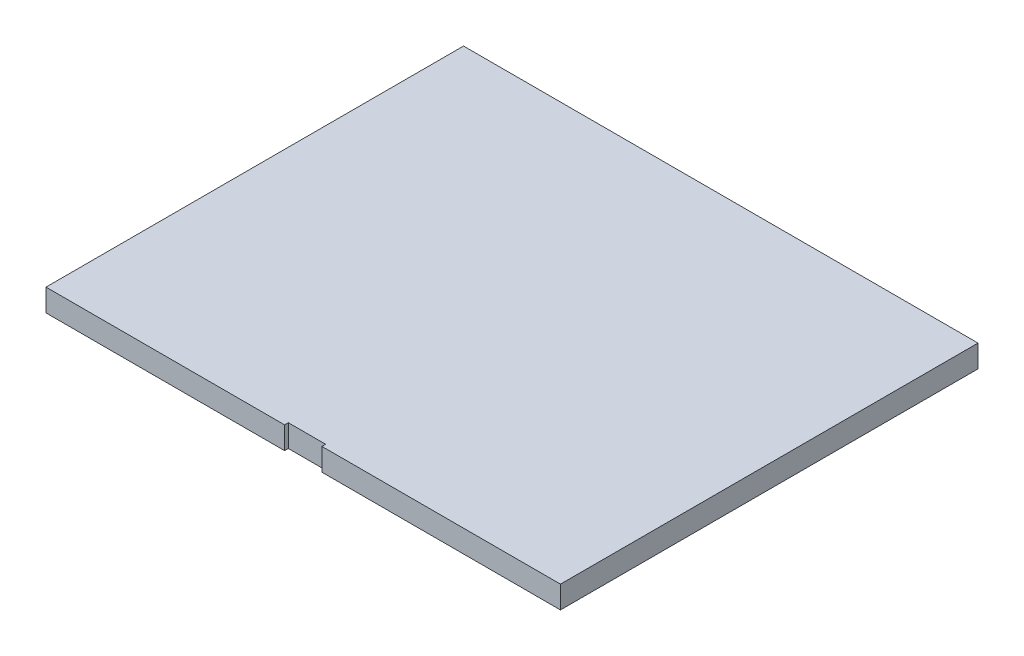
ISO-10303-21;
HEADER;
FILE_DESCRIPTION(('STEP AP214'),'2;1');
FILE_NAME('part.step','',(''),(''),'','','');
FILE_SCHEMA(('AUTOMOTIVE_DESIGN { 1 0 10303 214 1 1 1 1 }'));
ENDSEC;
DATA;
#1=APPLICATION_CONTEXT('core data for automotive mechanical design processes');
#2=APPLICATION_PROTOCOL_DEFINITION('international standard','automotive_design',2000,#1);
#3=PRODUCT_CONTEXT('',#1,'mechanical');
#4=PRODUCT('Part','Part','',(#3));
#5=PRODUCT_RELATED_PRODUCT_CATEGORY('part','',(#4));
#6=PRODUCT_DEFINITION_FORMATION('','',#4);
#7=PRODUCT_DEFINITION_CONTEXT('part definition',#1,'design');
#8=PRODUCT_DEFINITION('design','',#6,#7);
#9=PRODUCT_DEFINITION_SHAPE('','',#8);
#10=(LENGTH_UNIT() NAMED_UNIT(*) SI_UNIT(.MILLI.,.METRE.));
#11=(NAMED_UNIT(*) PLANE_ANGLE_UNIT() SI_UNIT($,.RADIAN.));
#12=(NAMED_UNIT(*) SI_UNIT($,.STERADIAN.) SOLID_ANGLE_UNIT());
#13=UNCERTAINTY_MEASURE_WITH_UNIT(LENGTH_MEASURE(1.E-05),#10,'distance_accuracy_value','');
#14=(GEOMETRIC_REPRESENTATION_CONTEXT(3) GLOBAL_UNCERTAINTY_ASSIGNED_CONTEXT((#13)) GLOBAL_UNIT_ASSIGNED_CONTEXT((#10,
#11,#12)) REPRESENTATION_CONTEXT('',''));
#15=CARTESIAN_POINT('',(0.,0.,0.));
#16=DIRECTION('',(0.,0.,1.));
#17=DIRECTION('',(1.,0.,0.));
#18=AXIS2_PLACEMENT_3D('',#15,#16,#17);
#19=CARTESIAN_POINT('',(0.,19.05,0.));
#20=DIRECTION('',(0.,0.,-1.));
#21=DIRECTION('',(-1.,0.,0.));
#22=AXIS2_PLACEMENT_3D('',#19,#20,#21);
#23=PLANE('',#22);
#24=DIRECTION('',(1.,0.,0.));
#25=VECTOR('',#24,1.);
#26=CARTESIAN_POINT('',(0.,0.,0.));
#27=LINE('',#26,#25);
#28=CARTESIAN_POINT('',(0.,0.,0.));
#29=VERTEX_POINT('',#28);
#30=CARTESIAN_POINT('',(203.2,0.,0.));
#31=VERTEX_POINT('',#30);
#32=EDGE_CURVE('E156',#29,#31,#27,.T.);
#33=ORIENTED_EDGE('',*,*,#32,.T.);
#34=DIRECTION('',(0.,1.,0.));
#35=VECTOR('',#34,1.);
#36=CARTESIAN_POINT('',(203.2,0.,0.));
#37=LINE('',#36,#35);
#38=CARTESIAN_POINT('',(203.2,19.05,0.));
#39=VERTEX_POINT('',#38);
#40=EDGE_CURVE('E165',#31,#39,#37,.T.);
#41=ORIENTED_EDGE('',*,*,#40,.T.);
#42=DIRECTION('',(1.,0.,0.));
#43=VECTOR('',#42,1.);
#44=CARTESIAN_POINT('',(0.,19.05,0.));
#45=LINE('',#44,#43);
#46=CARTESIAN_POINT('',(0.,19.05,0.));
#47=VERTEX_POINT('',#46);
#48=EDGE_CURVE('E102',#47,#39,#45,.T.);
#49=ORIENTED_EDGE('',*,*,#48,.F.);
#50=DIRECTION('',(0.,-1.,0.));
#51=VECTOR('',#50,1.);
#52=CARTESIAN_POINT('',(0.,19.05,0.));
#53=LINE('',#52,#51);
#54=EDGE_CURVE('E11',#47,#29,#53,.T.);
#55=ORIENTED_EDGE('',*,*,#54,.T.);
#56=EDGE_LOOP('',(#33,#41,#49,#55));
#57=FACE_BOUND('',#56,.T.);
#58=ADVANCED_FACE('F38',(#57),#23,.F.);
#59=CARTESIAN_POINT('',(0.,19.05,0.));
#60=DIRECTION('',(1.,0.,0.));
#61=DIRECTION('',(0.,0.,-1.));
#62=AXIS2_PLACEMENT_3D('',#59,#60,#61);
#63=PLANE('',#62);
#64=DIRECTION('',(0.,0.,1.));
#65=VECTOR('',#64,1.);
#66=CARTESIAN_POINT('',(0.,0.,0.));
#67=LINE('',#66,#65);
#68=CARTESIAN_POINT('',(0.,0.,-355.6));
#69=VERTEX_POINT('',#68);
#70=EDGE_CURVE('E157',#69,#29,#67,.T.);
#71=ORIENTED_EDGE('',*,*,#70,.T.);
#72=ORIENTED_EDGE('',*,*,#54,.F.);
#73=DIRECTION('',(0.,0.,1.));
#74=VECTOR('',#73,1.);
#75=CARTESIAN_POINT('',(0.,19.05,0.));
#76=LINE('',#75,#74);
#77=CARTESIAN_POINT('',(0.,19.05,-355.6));
#78=VERTEX_POINT('',#77);
#79=EDGE_CURVE('E173',#78,#47,#76,.T.);
#80=ORIENTED_EDGE('',*,*,#79,.F.);
#81=DIRECTION('',(0.,-1.,0.));
#82=VECTOR('',#81,1.);
#83=CARTESIAN_POINT('',(0.,19.05,-355.6));
#84=LINE('',#83,#82);
#85=EDGE_CURVE('E174',#78,#69,#84,.T.);
#86=ORIENTED_EDGE('',*,*,#85,.T.);
#87=EDGE_LOOP('',(#71,#72,#80,#86));
#88=FACE_BOUND('',#87,.T.);
#89=ADVANCED_FACE('F40',(#88),#63,.F.);
#90=CARTESIAN_POINT('',(234.95,19.05,0.));
#91=VERTEX_POINT('',#90);
#92=CARTESIAN_POINT('',(438.15,19.05,0.));
#93=VERTEX_POINT('',#92);
#94=EDGE_CURVE('E147',#91,#93,#45,.T.);
#95=ORIENTED_EDGE('',*,*,#94,.F.);
#96=DIRECTION('',(0.,1.,0.));
#97=VECTOR('',#96,1.);
#98=CARTESIAN_POINT('',(234.95,0.,0.));
#99=LINE('',#98,#97);
#100=CARTESIAN_POINT('',(234.95,0.,0.));
#101=VERTEX_POINT('',#100);
#102=EDGE_CURVE('E133',#101,#91,#99,.T.);
#103=ORIENTED_EDGE('',*,*,#102,.F.);
#104=CARTESIAN_POINT('',(438.15,0.,0.));
#105=VERTEX_POINT('',#104);
#106=EDGE_CURVE('E145',#101,#105,#27,.T.);
#107=ORIENTED_EDGE('',*,*,#106,.T.);
#108=DIRECTION('',(0.,-1.,0.));
#109=VECTOR('',#108,1.);
#110=CARTESIAN_POINT('',(438.15,19.05,0.));
#111=LINE('',#110,#109);
#112=EDGE_CURVE('E47',#93,#105,#111,.T.);
#113=ORIENTED_EDGE('',*,*,#112,.F.);
#114=EDGE_LOOP('',(#95,#103,#107,#113));
#115=FACE_BOUND('',#114,.T.);
#116=ADVANCED_FACE('F143',(#115),#23,.F.);
#117=CARTESIAN_POINT('',(438.15,19.05,0.));
#118=DIRECTION('',(-1.,0.,0.));
#119=DIRECTION('',(0.,0.,1.));
#120=AXIS2_PLACEMENT_3D('',#117,#118,#119);
#121=PLANE('',#120);
#122=DIRECTION('',(0.,0.,-1.));
#123=VECTOR('',#122,1.);
#124=CARTESIAN_POINT('',(438.15,0.,0.));
#125=LINE('',#124,#123);
#126=CARTESIAN_POINT('',(438.15,0.,-355.6));
#127=VERTEX_POINT('',#126);
#128=EDGE_CURVE('E154',#105,#127,#125,.T.);
#129=ORIENTED_EDGE('',*,*,#128,.T.);
#130=DIRECTION('',(0.,-1.,0.));
#131=VECTOR('',#130,1.);
#132=CARTESIAN_POINT('',(438.15,19.05,-355.6));
#133=LINE('',#132,#131);
#134=CARTESIAN_POINT('',(438.15,19.05,-355.6));
#135=VERTEX_POINT('',#134);
#136=EDGE_CURVE('E177',#135,#127,#133,.T.);
#137=ORIENTED_EDGE('',*,*,#136,.F.);
#138=DIRECTION('',(0.,0.,-1.));
#139=VECTOR('',#138,1.);
#140=CARTESIAN_POINT('',(438.15,19.05,0.));
#141=LINE('',#140,#139);
#142=EDGE_CURVE('E184',#93,#135,#141,.T.);
#143=ORIENTED_EDGE('',*,*,#142,.F.);
#144=ORIENTED_EDGE('',*,*,#112,.T.);
#145=EDGE_LOOP('',(#129,#137,#143,#144));
#146=FACE_BOUND('',#145,.T.);
#147=ADVANCED_FACE('F182',(#146),#121,.F.);
#148=CARTESIAN_POINT('',(0.,19.05,-355.6));
#149=DIRECTION('',(0.,0.,1.));
#150=DIRECTION('',(1.,0.,0.));
#151=AXIS2_PLACEMENT_3D('',#148,#149,#150);
#152=PLANE('',#151);
#153=DIRECTION('',(-1.,0.,0.));
#154=VECTOR('',#153,1.);
#155=CARTESIAN_POINT('',(0.,0.,-355.6));
#156=LINE('',#155,#154);
#157=EDGE_CURVE('E95',#127,#69,#156,.T.);
#158=ORIENTED_EDGE('',*,*,#157,.T.);
#159=ORIENTED_EDGE('',*,*,#85,.F.);
#160=DIRECTION('',(-1.,0.,0.));
#161=VECTOR('',#160,1.);
#162=CARTESIAN_POINT('',(0.,19.05,-355.6));
#163=LINE('',#162,#161);
#164=EDGE_CURVE('E69',#135,#78,#163,.T.);
#165=ORIENTED_EDGE('',*,*,#164,.F.);
#166=ORIENTED_EDGE('',*,*,#136,.T.);
#167=EDGE_LOOP('',(#158,#159,#165,#166));
#168=FACE_BOUND('',#167,.T.);
#169=ADVANCED_FACE('F217',(#168),#152,.F.);
#170=CARTESIAN_POINT('',(0.,19.05,0.));
#171=DIRECTION('',(0.,-1.,0.));
#172=DIRECTION('',(0.,0.,-1.));
#173=AXIS2_PLACEMENT_3D('',#170,#171,#172);
#174=PLANE('',#173);
#175=ORIENTED_EDGE('',*,*,#48,.T.);
#176=DIRECTION('',(0.,0.,1.));
#177=VECTOR('',#176,1.);
#178=CARTESIAN_POINT('',(203.2,19.05,0.));
#179=LINE('',#178,#177);
#180=CARTESIAN_POINT('',(203.2,19.05,-3.17500000000004));
#181=VERTEX_POINT('',#180);
#182=EDGE_CURVE('E139',#181,#39,#179,.T.);
#183=ORIENTED_EDGE('',*,*,#182,.F.);
#184=DIRECTION('',(-1.,0.,0.));
#185=VECTOR('',#184,1.);
#186=CARTESIAN_POINT('',(203.2,19.05,-3.17500000000004));
#187=LINE('',#186,#185);
#188=CARTESIAN_POINT('',(234.95,19.05,-3.17500000000003));
#189=VERTEX_POINT('',#188);
#190=EDGE_CURVE('E201',#189,#181,#187,.T.);
#191=ORIENTED_EDGE('',*,*,#190,.F.);
#192=DIRECTION('',(0.,0.,-1.));
#193=VECTOR('',#192,1.);
#194=CARTESIAN_POINT('',(234.95,19.05,-3.17500000000003));
#195=LINE('',#194,#193);
#196=EDGE_CURVE('E205',#91,#189,#195,.T.);
#197=ORIENTED_EDGE('',*,*,#196,.F.);
#198=ORIENTED_EDGE('',*,*,#94,.T.);
#199=ORIENTED_EDGE('',*,*,#142,.T.);
#200=ORIENTED_EDGE('',*,*,#164,.T.);
#201=ORIENTED_EDGE('',*,*,#79,.T.);
#202=EDGE_LOOP('',(#175,#183,#191,#197,#198,#199,#200,#201));
#203=FACE_BOUND('',#202,.T.);
#204=ADVANCED_FACE('F219',(#203),#174,.F.);
#205=CARTESIAN_POINT('',(0.,0.,0.));
#206=DIRECTION('',(0.,-1.,0.));
#207=DIRECTION('',(0.,0.,-1.));
#208=AXIS2_PLACEMENT_3D('',#205,#206,#207);
#209=PLANE('',#208);
#210=DIRECTION('',(0.,0.,1.));
#211=VECTOR('',#210,1.);
#212=CARTESIAN_POINT('',(203.2,0.,0.));
#213=LINE('',#212,#211);
#214=CARTESIAN_POINT('',(203.2,0.,-3.17500000000004));
#215=VERTEX_POINT('',#214);
#216=EDGE_CURVE('E149',#215,#31,#213,.T.);
#217=ORIENTED_EDGE('',*,*,#216,.T.);
#218=ORIENTED_EDGE('',*,*,#32,.F.);
#219=ORIENTED_EDGE('',*,*,#70,.F.);
#220=ORIENTED_EDGE('',*,*,#157,.F.);
#221=ORIENTED_EDGE('',*,*,#128,.F.);
#222=ORIENTED_EDGE('',*,*,#106,.F.);
#223=DIRECTION('',(0.,0.,-1.));
#224=VECTOR('',#223,1.);
#225=CARTESIAN_POINT('',(234.95,0.,-3.17500000000003));
#226=LINE('',#225,#224);
#227=CARTESIAN_POINT('',(234.95,0.,-3.17500000000003));
#228=VERTEX_POINT('',#227);
#229=EDGE_CURVE('E129',#101,#228,#226,.T.);
#230=ORIENTED_EDGE('',*,*,#229,.T.);
#231=DIRECTION('',(-1.,0.,0.));
#232=VECTOR('',#231,1.);
#233=CARTESIAN_POINT('',(203.2,0.,-3.17500000000004));
#234=LINE('',#233,#232);
#235=EDGE_CURVE('E57',#228,#215,#234,.T.);
#236=ORIENTED_EDGE('',*,*,#235,.T.);
#237=EDGE_LOOP('',(#217,#218,#219,#220,#221,#222,#230,#236));
#238=FACE_BOUND('',#237,.T.);
#239=ADVANCED_FACE('F153',(#238),#209,.T.);
#240=CARTESIAN_POINT('',(203.2,0.,0.));
#241=DIRECTION('',(-1.,0.,0.));
#242=DIRECTION('',(0.,0.,1.));
#243=AXIS2_PLACEMENT_3D('',#240,#241,#242);
#244=PLANE('',#243);
#245=ORIENTED_EDGE('',*,*,#182,.T.);
#246=ORIENTED_EDGE('',*,*,#40,.F.);
#247=ORIENTED_EDGE('',*,*,#216,.F.);
#248=DIRECTION('',(0.,1.,0.));
#249=VECTOR('',#248,1.);
#250=CARTESIAN_POINT('',(203.2,0.,-3.17500000000004));
#251=LINE('',#250,#249);
#252=EDGE_CURVE('E194',#215,#181,#251,.T.);
#253=ORIENTED_EDGE('',*,*,#252,.T.);
#254=EDGE_LOOP('',(#245,#246,#247,#253));
#255=FACE_BOUND('',#254,.T.);
#256=ADVANCED_FACE('F251',(#255),#244,.F.);
#257=CARTESIAN_POINT('',(203.2,0.,-3.17500000000004));
#258=DIRECTION('',(0.,0.,-1.));
#259=DIRECTION('',(-1.,0.,0.));
#260=AXIS2_PLACEMENT_3D('',#257,#258,#259);
#261=PLANE('',#260);
#262=ORIENTED_EDGE('',*,*,#190,.T.);
#263=ORIENTED_EDGE('',*,*,#252,.F.);
#264=ORIENTED_EDGE('',*,*,#235,.F.);
#265=DIRECTION('',(0.,1.,0.));
#266=VECTOR('',#265,1.);
#267=CARTESIAN_POINT('',(234.95,0.,-3.17500000000003));
#268=LINE('',#267,#266);
#269=EDGE_CURVE('E135',#228,#189,#268,.T.);
#270=ORIENTED_EDGE('',*,*,#269,.T.);
#271=EDGE_LOOP('',(#262,#263,#264,#270));
#272=FACE_BOUND('',#271,.T.);
#273=ADVANCED_FACE('F280',(#272),#261,.F.);
#274=CARTESIAN_POINT('',(234.95,0.,-3.17500000000003));
#275=DIRECTION('',(1.,0.,0.));
#276=DIRECTION('',(0.,0.,-1.));
#277=AXIS2_PLACEMENT_3D('',#274,#275,#276);
#278=PLANE('',#277);
#279=ORIENTED_EDGE('',*,*,#196,.T.);
#280=ORIENTED_EDGE('',*,*,#269,.F.);
#281=ORIENTED_EDGE('',*,*,#229,.F.);
#282=ORIENTED_EDGE('',*,*,#102,.T.);
#283=EDGE_LOOP('',(#279,#280,#281,#282));
#284=FACE_BOUND('',#283,.T.);
#285=ADVANCED_FACE('F132',(#284),#278,.F.);
#286=CLOSED_SHELL('',(#58,#89,#116,#147,#169,#204,#239,#256,#273,#285));
#287=MANIFOLD_SOLID_BREP('B2',#286);
#288=ADVANCED_BREP_SHAPE_REPRESENTATION('',(#18,#287),#14);
#289=SHAPE_DEFINITION_REPRESENTATION(#9,#288);
ENDSEC;
END-ISO-10303-21;
